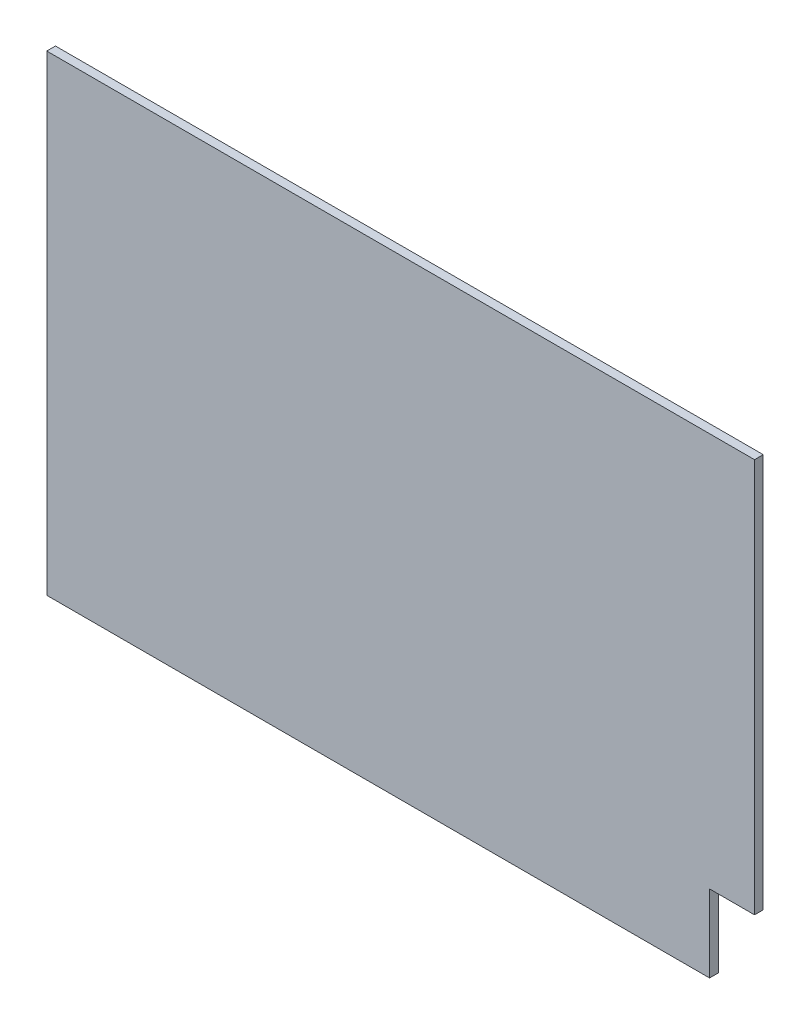
ISO-10303-21;
HEADER;
FILE_DESCRIPTION(('STEP AP214'),'2;1');
FILE_NAME('part.step','',(''),(''),'','','');
FILE_SCHEMA(('AUTOMOTIVE_DESIGN { 1 0 10303 214 1 1 1 1 }'));
ENDSEC;
DATA;
#1=APPLICATION_CONTEXT('core data for automotive mechanical design processes');
#2=APPLICATION_PROTOCOL_DEFINITION('international standard','automotive_design',2000,#1);
#3=PRODUCT_CONTEXT('',#1,'mechanical');
#4=PRODUCT('Part','Part','',(#3));
#5=PRODUCT_RELATED_PRODUCT_CATEGORY('part','',(#4));
#6=PRODUCT_DEFINITION_FORMATION('','',#4);
#7=PRODUCT_DEFINITION_CONTEXT('part definition',#1,'design');
#8=PRODUCT_DEFINITION('design','',#6,#7);
#9=PRODUCT_DEFINITION_SHAPE('','',#8);
#10=(LENGTH_UNIT() NAMED_UNIT(*) SI_UNIT(.MILLI.,.METRE.));
#11=(NAMED_UNIT(*) PLANE_ANGLE_UNIT() SI_UNIT($,.RADIAN.));
#12=(NAMED_UNIT(*) SI_UNIT($,.STERADIAN.) SOLID_ANGLE_UNIT());
#13=UNCERTAINTY_MEASURE_WITH_UNIT(LENGTH_MEASURE(1.E-05),#10,'distance_accuracy_value','');
#14=(GEOMETRIC_REPRESENTATION_CONTEXT(3) GLOBAL_UNCERTAINTY_ASSIGNED_CONTEXT((#13)) GLOBAL_UNIT_ASSIGNED_CONTEXT((#10,
#11,#12)) REPRESENTATION_CONTEXT('',''));
#15=CARTESIAN_POINT('',(0.,0.,0.));
#16=DIRECTION('',(0.,0.,1.));
#17=DIRECTION('',(1.,0.,0.));
#18=AXIS2_PLACEMENT_3D('',#15,#16,#17);
#19=CARTESIAN_POINT('',(0.,0.,30.));
#20=DIRECTION('',(1.,0.,0.));
#21=DIRECTION('',(0.,1.,0.));
#22=AXIS2_PLACEMENT_3D('',#19,#20,#21);
#23=PLANE('',#22);
#24=DIRECTION('',(0.,-1.,0.));
#25=VECTOR('',#24,1.);
#26=CARTESIAN_POINT('',(0.,0.,0.));
#27=LINE('',#26,#25);
#28=CARTESIAN_POINT('',(-4.44089209850063E-13,1625.,0.));
#29=VERTEX_POINT('',#28);
#30=CARTESIAN_POINT('',(0.,0.,0.));
#31=VERTEX_POINT('',#30);
#32=EDGE_CURVE('E130',#29,#31,#27,.T.);
#33=ORIENTED_EDGE('',*,*,#32,.T.);
#34=DIRECTION('',(0.,0.,-1.));
#35=VECTOR('',#34,1.);
#36=CARTESIAN_POINT('',(0.,0.,30.));
#37=LINE('',#36,#35);
#38=CARTESIAN_POINT('',(0.,0.,30.));
#39=VERTEX_POINT('',#38);
#40=EDGE_CURVE('E11',#39,#31,#37,.T.);
#41=ORIENTED_EDGE('',*,*,#40,.F.);
#42=DIRECTION('',(0.,-1.,0.));
#43=VECTOR('',#42,1.);
#44=CARTESIAN_POINT('',(0.,0.,30.));
#45=LINE('',#44,#43);
#46=CARTESIAN_POINT('',(-4.44089209850063E-13,1625.,30.));
#47=VERTEX_POINT('',#46);
#48=EDGE_CURVE('E146',#47,#39,#45,.T.);
#49=ORIENTED_EDGE('',*,*,#48,.F.);
#50=DIRECTION('',(0.,0.,-1.));
#51=VECTOR('',#50,1.);
#52=CARTESIAN_POINT('',(-4.44089209850063E-13,1625.,30.));
#53=LINE('',#52,#51);
#54=EDGE_CURVE('E126',#47,#29,#53,.T.);
#55=ORIENTED_EDGE('',*,*,#54,.T.);
#56=EDGE_LOOP('',(#33,#41,#49,#55));
#57=FACE_BOUND('',#56,.T.);
#58=ADVANCED_FACE('F41',(#57),#23,.F.);
#59=CARTESIAN_POINT('',(0.,0.,30.));
#60=DIRECTION('',(0.,1.,0.));
#61=DIRECTION('',(-1.,0.,0.));
#62=AXIS2_PLACEMENT_3D('',#59,#60,#61);
#63=PLANE('',#62);
#64=DIRECTION('',(1.,0.,0.));
#65=VECTOR('',#64,1.);
#66=CARTESIAN_POINT('',(0.,0.,0.));
#67=LINE('',#66,#65);
#68=CARTESIAN_POINT('',(2285.,0.,0.));
#69=VERTEX_POINT('',#68);
#70=EDGE_CURVE('E134',#31,#69,#67,.T.);
#71=ORIENTED_EDGE('',*,*,#70,.T.);
#72=DIRECTION('',(0.,0.,-1.));
#73=VECTOR('',#72,1.);
#74=CARTESIAN_POINT('',(2285.,0.,30.));
#75=LINE('',#74,#73);
#76=CARTESIAN_POINT('',(2285.,0.,30.));
#77=VERTEX_POINT('',#76);
#78=EDGE_CURVE('E50',#77,#69,#75,.T.);
#79=ORIENTED_EDGE('',*,*,#78,.F.);
#80=DIRECTION('',(1.,0.,0.));
#81=VECTOR('',#80,1.);
#82=CARTESIAN_POINT('',(0.,0.,30.));
#83=LINE('',#82,#81);
#84=EDGE_CURVE('E95',#39,#77,#83,.T.);
#85=ORIENTED_EDGE('',*,*,#84,.F.);
#86=ORIENTED_EDGE('',*,*,#40,.T.);
#87=EDGE_LOOP('',(#71,#79,#85,#86));
#88=FACE_BOUND('',#87,.T.);
#89=ADVANCED_FACE('F174',(#88),#63,.F.);
#90=CARTESIAN_POINT('',(2285.,0.,30.));
#91=DIRECTION('',(-1.,0.,0.));
#92=DIRECTION('',(0.,0.,1.));
#93=AXIS2_PLACEMENT_3D('',#90,#91,#92);
#94=PLANE('',#93);
#95=DIRECTION('',(0.,1.,0.));
#96=VECTOR('',#95,1.);
#97=CARTESIAN_POINT('',(2285.,0.,0.));
#98=LINE('',#97,#96);
#99=CARTESIAN_POINT('',(2285.,266.,0.));
#100=VERTEX_POINT('',#99);
#101=EDGE_CURVE('E137',#69,#100,#98,.T.);
#102=ORIENTED_EDGE('',*,*,#101,.T.);
#103=DIRECTION('',(0.,0.,-1.));
#104=VECTOR('',#103,1.);
#105=CARTESIAN_POINT('',(2285.,266.,30.));
#106=LINE('',#105,#104);
#107=CARTESIAN_POINT('',(2285.,266.,30.));
#108=VERTEX_POINT('',#107);
#109=EDGE_CURVE('E119',#108,#100,#106,.T.);
#110=ORIENTED_EDGE('',*,*,#109,.F.);
#111=DIRECTION('',(0.,1.,0.));
#112=VECTOR('',#111,1.);
#113=CARTESIAN_POINT('',(2285.,0.,30.));
#114=LINE('',#113,#112);
#115=EDGE_CURVE('E108',#77,#108,#114,.T.);
#116=ORIENTED_EDGE('',*,*,#115,.F.);
#117=ORIENTED_EDGE('',*,*,#78,.T.);
#118=EDGE_LOOP('',(#102,#110,#116,#117));
#119=FACE_BOUND('',#118,.T.);
#120=ADVANCED_FACE('F156',(#119),#94,.F.);
#121=CARTESIAN_POINT('',(2440.,266.,30.));
#122=DIRECTION('',(0.,1.,0.));
#123=DIRECTION('',(0.,0.,1.));
#124=AXIS2_PLACEMENT_3D('',#121,#122,#123);
#125=PLANE('',#124);
#126=DIRECTION('',(1.,0.,0.));
#127=VECTOR('',#126,1.);
#128=CARTESIAN_POINT('',(2440.,266.,0.));
#129=LINE('',#128,#127);
#130=CARTESIAN_POINT('',(2440.,266.,0.));
#131=VERTEX_POINT('',#130);
#132=EDGE_CURVE('E117',#100,#131,#129,.T.);
#133=ORIENTED_EDGE('',*,*,#132,.T.);
#134=DIRECTION('',(0.,0.,-1.));
#135=VECTOR('',#134,1.);
#136=CARTESIAN_POINT('',(2440.,266.,30.));
#137=LINE('',#136,#135);
#138=CARTESIAN_POINT('',(2440.,266.,30.));
#139=VERTEX_POINT('',#138);
#140=EDGE_CURVE('E114',#139,#131,#137,.T.);
#141=ORIENTED_EDGE('',*,*,#140,.F.);
#142=DIRECTION('',(1.,0.,0.));
#143=VECTOR('',#142,1.);
#144=CARTESIAN_POINT('',(2440.,266.,30.));
#145=LINE('',#144,#143);
#146=EDGE_CURVE('E102',#108,#139,#145,.T.);
#147=ORIENTED_EDGE('',*,*,#146,.F.);
#148=ORIENTED_EDGE('',*,*,#109,.T.);
#149=EDGE_LOOP('',(#133,#141,#147,#148));
#150=FACE_BOUND('',#149,.T.);
#151=ADVANCED_FACE('F115',(#150),#125,.F.);
#152=CARTESIAN_POINT('',(2440.,266.,30.));
#153=DIRECTION('',(-1.,0.,0.));
#154=DIRECTION('',(0.,-1.,0.));
#155=AXIS2_PLACEMENT_3D('',#152,#153,#154);
#156=PLANE('',#155);
#157=DIRECTION('',(0.,1.,0.));
#158=VECTOR('',#157,1.);
#159=CARTESIAN_POINT('',(2440.,266.,0.));
#160=LINE('',#159,#158);
#161=CARTESIAN_POINT('',(2440.,1625.,0.));
#162=VERTEX_POINT('',#161);
#163=EDGE_CURVE('E81',#131,#162,#160,.T.);
#164=ORIENTED_EDGE('',*,*,#163,.T.);
#165=DIRECTION('',(0.,0.,-1.));
#166=VECTOR('',#165,1.);
#167=CARTESIAN_POINT('',(2440.,1625.,30.));
#168=LINE('',#167,#166);
#169=CARTESIAN_POINT('',(2440.,1625.,30.));
#170=VERTEX_POINT('',#169);
#171=EDGE_CURVE('E120',#170,#162,#168,.T.);
#172=ORIENTED_EDGE('',*,*,#171,.F.);
#173=DIRECTION('',(0.,1.,0.));
#174=VECTOR('',#173,1.);
#175=CARTESIAN_POINT('',(2440.,266.,30.));
#176=LINE('',#175,#174);
#177=EDGE_CURVE('E106',#139,#170,#176,.T.);
#178=ORIENTED_EDGE('',*,*,#177,.F.);
#179=ORIENTED_EDGE('',*,*,#140,.T.);
#180=EDGE_LOOP('',(#164,#172,#178,#179));
#181=FACE_BOUND('',#180,.T.);
#182=ADVANCED_FACE('F122',(#181),#156,.F.);
#183=CARTESIAN_POINT('',(-4.44089209850063E-13,1625.,30.));
#184=DIRECTION('',(0.,-1.,0.));
#185=DIRECTION('',(0.,0.,-1.));
#186=AXIS2_PLACEMENT_3D('',#183,#184,#185);
#187=PLANE('',#186);
#188=DIRECTION('',(-1.,0.,0.));
#189=VECTOR('',#188,1.);
#190=CARTESIAN_POINT('',(-4.44089209850063E-13,1625.,0.));
#191=LINE('',#190,#189);
#192=EDGE_CURVE('E87',#162,#29,#191,.T.);
#193=ORIENTED_EDGE('',*,*,#192,.T.);
#194=ORIENTED_EDGE('',*,*,#54,.F.);
#195=DIRECTION('',(-1.,0.,0.));
#196=VECTOR('',#195,1.);
#197=CARTESIAN_POINT('',(-4.44089209850063E-13,1625.,30.));
#198=LINE('',#197,#196);
#199=EDGE_CURVE('E58',#170,#47,#198,.T.);
#200=ORIENTED_EDGE('',*,*,#199,.F.);
#201=ORIENTED_EDGE('',*,*,#171,.T.);
#202=EDGE_LOOP('',(#193,#194,#200,#201));
#203=FACE_BOUND('',#202,.T.);
#204=ADVANCED_FACE('F163',(#203),#187,.F.);
#205=CARTESIAN_POINT('',(0.,0.,30.));
#206=DIRECTION('',(0.,0.,-1.));
#207=DIRECTION('',(-1.,0.,0.));
#208=AXIS2_PLACEMENT_3D('',#205,#206,#207);
#209=PLANE('',#208);
#210=ORIENTED_EDGE('',*,*,#48,.T.);
#211=ORIENTED_EDGE('',*,*,#84,.T.);
#212=ORIENTED_EDGE('',*,*,#115,.T.);
#213=ORIENTED_EDGE('',*,*,#146,.T.);
#214=ORIENTED_EDGE('',*,*,#177,.T.);
#215=ORIENTED_EDGE('',*,*,#199,.T.);
#216=EDGE_LOOP('',(#210,#211,#212,#213,#214,#215));
#217=FACE_BOUND('',#216,.T.);
#218=ADVANCED_FACE('F104',(#217),#209,.F.);
#219=CARTESIAN_POINT('',(0.,0.,0.));
#220=DIRECTION('',(0.,0.,-1.));
#221=DIRECTION('',(-1.,0.,0.));
#222=AXIS2_PLACEMENT_3D('',#219,#220,#221);
#223=PLANE('',#222);
#224=ORIENTED_EDGE('',*,*,#32,.F.);
#225=ORIENTED_EDGE('',*,*,#192,.F.);
#226=ORIENTED_EDGE('',*,*,#163,.F.);
#227=ORIENTED_EDGE('',*,*,#132,.F.);
#228=ORIENTED_EDGE('',*,*,#101,.F.);
#229=ORIENTED_EDGE('',*,*,#70,.F.);
#230=EDGE_LOOP('',(#224,#225,#226,#227,#228,#229));
#231=FACE_BOUND('',#230,.T.);
#232=ADVANCED_FACE('F159',(#231),#223,.T.);
#233=CLOSED_SHELL('',(#58,#89,#120,#151,#182,#204,#218,#232));
#234=MANIFOLD_SOLID_BREP('B2',#233);
#235=ADVANCED_BREP_SHAPE_REPRESENTATION('',(#18,#234),#14);
#236=SHAPE_DEFINITION_REPRESENTATION(#9,#235);
ENDSEC;
END-ISO-10303-21;
